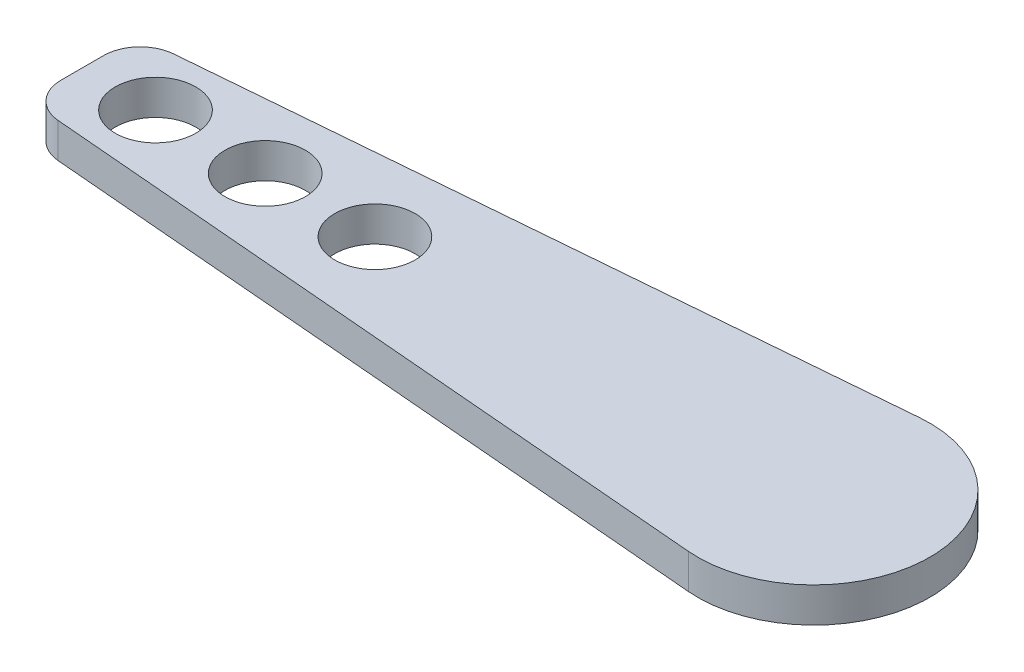
ISO-10303-21;
HEADER;
FILE_DESCRIPTION(('STEP AP214'),'2;1');
FILE_NAME('part.step','',(''),(''),'','','');
FILE_SCHEMA(('AUTOMOTIVE_DESIGN { 1 0 10303 214 1 1 1 1 }'));
ENDSEC;
DATA;
#1=APPLICATION_CONTEXT('core data for automotive mechanical design processes');
#2=APPLICATION_PROTOCOL_DEFINITION('international standard','automotive_design',2000,#1);
#3=PRODUCT_CONTEXT('',#1,'mechanical');
#4=PRODUCT('Part','Part','',(#3));
#5=PRODUCT_RELATED_PRODUCT_CATEGORY('part','',(#4));
#6=PRODUCT_DEFINITION_FORMATION('','',#4);
#7=PRODUCT_DEFINITION_CONTEXT('part definition',#1,'design');
#8=PRODUCT_DEFINITION('design','',#6,#7);
#9=PRODUCT_DEFINITION_SHAPE('','',#8);
#10=(LENGTH_UNIT() NAMED_UNIT(*) SI_UNIT(.MILLI.,.METRE.));
#11=(NAMED_UNIT(*) PLANE_ANGLE_UNIT() SI_UNIT($,.RADIAN.));
#12=(NAMED_UNIT(*) SI_UNIT($,.STERADIAN.) SOLID_ANGLE_UNIT());
#13=UNCERTAINTY_MEASURE_WITH_UNIT(LENGTH_MEASURE(1.E-05),#10,'distance_accuracy_value','');
#14=(GEOMETRIC_REPRESENTATION_CONTEXT(3) GLOBAL_UNCERTAINTY_ASSIGNED_CONTEXT((#13)) GLOBAL_UNIT_ASSIGNED_CONTEXT((#10,
#11,#12)) REPRESENTATION_CONTEXT('',''));
#15=CARTESIAN_POINT('',(0.,0.,0.));
#16=DIRECTION('',(0.,0.,1.));
#17=DIRECTION('',(1.,0.,0.));
#18=AXIS2_PLACEMENT_3D('',#15,#16,#17);
#19=CARTESIAN_POINT('',(-1.3337407331196,4.7625,15.8188735584054));
#20=DIRECTION('',(0.0840151642909981,0.,-0.996464476120025));
#21=DIRECTION('',(-0.996464476120025,0.,-0.0840151642909981));
#22=AXIS2_PLACEMENT_3D('',#19,#20,#21);
#23=PLANE('',#22);
#24=DIRECTION('',(0.996464476120026,0.,0.0840151642909981));
#25=VECTOR('',#24,1.);
#26=CARTESIAN_POINT('',(-1.3337407331196,4.7625,15.8188735584054));
#27=LINE('',#26,#25);
#28=CARTESIAN_POINT('',(-95.420075821455,4.7625,7.88614831890346));
#29=VERTEX_POINT('',#28);
#30=CARTESIAN_POINT('',(-1.3337407331196,4.7625,15.8188735584054));
#31=VERTEX_POINT('',#30);
#32=EDGE_CURVE('E92',#29,#31,#27,.T.);
#33=ORIENTED_EDGE('',*,*,#32,.F.);
#34=DIRECTION('',(0.,-1.,0.));
#35=VECTOR('',#34,1.);
#36=CARTESIAN_POINT('',(-95.420075821455,0.,7.88614831890347));
#37=LINE('',#36,#35);
#38=CARTESIAN_POINT('',(-95.420075821455,0.,7.88614831890346));
#39=VERTEX_POINT('',#38);
#40=EDGE_CURVE('E11',#29,#39,#37,.T.);
#41=ORIENTED_EDGE('',*,*,#40,.T.);
#42=DIRECTION('',(0.996464476120026,0.,0.0840151642909981));
#43=VECTOR('',#42,1.);
#44=CARTESIAN_POINT('',(-1.3337407331196,0.,15.8188735584054));
#45=LINE('',#44,#43);
#46=CARTESIAN_POINT('',(-1.3337407331196,0.,15.8188735584054));
#47=VERTEX_POINT('',#46);
#48=EDGE_CURVE('E111',#39,#47,#45,.T.);
#49=ORIENTED_EDGE('',*,*,#48,.T.);
#50=DIRECTION('',(0.,-1.,0.));
#51=VECTOR('',#50,1.);
#52=CARTESIAN_POINT('',(-1.3337407331196,4.7625,15.8188735584054));
#53=LINE('',#52,#51);
#54=EDGE_CURVE('E105',#31,#47,#53,.T.);
#55=ORIENTED_EDGE('',*,*,#54,.F.);
#56=EDGE_LOOP('',(#33,#41,#49,#55));
#57=FACE_BOUND('',#56,.T.);
#58=ADVANCED_FACE('F39',(#57),#23,.F.);
#59=CARTESIAN_POINT('',(0.,4.7625,0.));
#60=DIRECTION('',(0.,-1.,0.));
#61=DIRECTION('',(0.,0.,-1.));
#62=AXIS2_PLACEMENT_3D('',#59,#60,#61);
#63=CYLINDRICAL_SURFACE('',#62,15.875);
#64=CARTESIAN_POINT('',(0.,0.,0.));
#65=DIRECTION('',(0.,1.,0.));
#66=DIRECTION('',(0.,0.,1.));
#67=AXIS2_PLACEMENT_3D('',#64,#65,#66);
#68=CIRCLE('',#67,15.875);
#69=CARTESIAN_POINT('',(-1.3337407331196,0.,-15.8188735584054));
#70=VERTEX_POINT('',#69);
#71=EDGE_CURVE('E145',#47,#70,#68,.T.);
#72=ORIENTED_EDGE('',*,*,#71,.T.);
#73=DIRECTION('',(0.,-1.,0.));
#74=VECTOR('',#73,1.);
#75=CARTESIAN_POINT('',(-1.3337407331196,4.7625,-15.8188735584054));
#76=LINE('',#75,#74);
#77=CARTESIAN_POINT('',(-1.3337407331196,4.7625,-15.8188735584054));
#78=VERTEX_POINT('',#77);
#79=EDGE_CURVE('E107',#78,#70,#76,.T.);
#80=ORIENTED_EDGE('',*,*,#79,.F.);
#81=CARTESIAN_POINT('',(0.,4.7625,0.));
#82=DIRECTION('',(0.,1.,0.));
#83=DIRECTION('',(0.,0.,1.));
#84=AXIS2_PLACEMENT_3D('',#81,#82,#83);
#85=CIRCLE('',#84,15.875);
#86=EDGE_CURVE('E95',#31,#78,#85,.T.);
#87=ORIENTED_EDGE('',*,*,#86,.F.);
#88=ORIENTED_EDGE('',*,*,#54,.T.);
#89=EDGE_LOOP('',(#72,#80,#87,#88));
#90=FACE_BOUND('',#89,.T.);
#91=ADVANCED_FACE('F104',(#90),#63,.T.);
#92=CARTESIAN_POINT('',(-1.3337407331196,4.7625,-15.8188735584054));
#93=DIRECTION('',(0.0840151642909981,0.,0.996464476120025));
#94=DIRECTION('',(0.996464476120025,0.,-0.0840151642909981));
#95=AXIS2_PLACEMENT_3D('',#92,#93,#94);
#96=PLANE('',#95);
#97=DIRECTION('',(-0.996464476120026,0.,0.0840151642909981));
#98=VECTOR('',#97,1.);
#99=CARTESIAN_POINT('',(-1.3337407331196,0.,-15.8188735584054));
#100=LINE('',#99,#98);
#101=CARTESIAN_POINT('',(-95.420075821455,0.,-7.88614831890346));
#102=VERTEX_POINT('',#101);
#103=EDGE_CURVE('E142',#70,#102,#100,.T.);
#104=ORIENTED_EDGE('',*,*,#103,.T.);
#105=DIRECTION('',(0.,-1.,0.));
#106=VECTOR('',#105,1.);
#107=CARTESIAN_POINT('',(-95.420075821455,4.7625,-7.88614831890346));
#108=LINE('',#107,#106);
#109=CARTESIAN_POINT('',(-95.420075821455,4.7625,-7.88614831890346));
#110=VERTEX_POINT('',#109);
#111=EDGE_CURVE('E62',#102,#110,#108,.F.);
#112=ORIENTED_EDGE('',*,*,#111,.T.);
#113=DIRECTION('',(-0.996464476120026,0.,0.0840151642909981));
#114=VECTOR('',#113,1.);
#115=CARTESIAN_POINT('',(-1.3337407331196,4.7625,-15.8188735584054));
#116=LINE('',#115,#114);
#117=EDGE_CURVE('E108',#78,#110,#116,.T.);
#118=ORIENTED_EDGE('',*,*,#117,.F.);
#119=ORIENTED_EDGE('',*,*,#79,.T.);
#120=EDGE_LOOP('',(#104,#112,#118,#119));
#121=FACE_BOUND('',#120,.T.);
#122=ADVANCED_FACE('F144',(#121),#96,.F.);
#123=CARTESIAN_POINT('',(-90.,4.7625,0.));
#124=DIRECTION('',(0.,-1.,0.));
#125=DIRECTION('',(0.,0.,-1.));
#126=AXIS2_PLACEMENT_3D('',#123,#124,#125);
#127=CYLINDRICAL_SURFACE('',#126,5.5);
#128=CARTESIAN_POINT('',(-90.,4.7625,0.));
#129=DIRECTION('',(0.,1.,0.));
#130=DIRECTION('',(0.,0.,1.));
#131=AXIS2_PLACEMENT_3D('',#128,#129,#130);
#132=CIRCLE('',#131,5.5);
#133=CARTESIAN_POINT('',(-90.,4.7625,-5.5));
#134=VERTEX_POINT('',#133);
#135=EDGE_CURVE('E100',#134,#134,#132,.T.);
#136=CARTESIAN_POINT('',(-90.,0.,0.));
#137=DIRECTION('',(0.,1.,0.));
#138=DIRECTION('',(0.,0.,1.));
#139=AXIS2_PLACEMENT_3D('',#136,#137,#138);
#140=CIRCLE('',#139,5.5);
#141=CARTESIAN_POINT('',(-90.,0.,-5.5));
#142=VERTEX_POINT('',#141);
#143=EDGE_CURVE('E151',#142,#142,#140,.T.);
#144=CARTESIAN_POINT('',(-90.,4.7625,-5.5));
#145=CARTESIAN_POINT('',(-90.,4.712890625,-5.5));
#146=CARTESIAN_POINT('',(-90.,4.66328125,-5.5));
#147=CARTESIAN_POINT('',(-90.,4.5640625,-5.5));
#148=CARTESIAN_POINT('',(-90.,4.514453125,-5.5));
#149=CARTESIAN_POINT('',(-90.,4.415234375,-5.5));
#150=CARTESIAN_POINT('',(-90.,4.365625,-5.5));
#151=CARTESIAN_POINT('',(-90.,4.26640625,-5.5));
#152=CARTESIAN_POINT('',(-90.,4.216796875,-5.5));
#153=CARTESIAN_POINT('',(-90.,4.117578125,-5.5));
#154=CARTESIAN_POINT('',(-90.,4.06796875,-5.5));
#155=CARTESIAN_POINT('',(-90.,3.96875,-5.5));
#156=CARTESIAN_POINT('',(-90.,3.919140625,-5.5));
#157=CARTESIAN_POINT('',(-90.,3.819921875,-5.5));
#158=CARTESIAN_POINT('',(-90.,3.7703125,-5.5));
#159=CARTESIAN_POINT('',(-90.,3.67109375,-5.5));
#160=CARTESIAN_POINT('',(-90.,3.621484375,-5.5));
#161=CARTESIAN_POINT('',(-90.,3.522265625,-5.5));
#162=CARTESIAN_POINT('',(-90.,3.47265625,-5.5));
#163=CARTESIAN_POINT('',(-90.,3.3734375,-5.5));
#164=CARTESIAN_POINT('',(-90.,3.323828125,-5.5));
#165=CARTESIAN_POINT('',(-90.,3.224609375,-5.5));
#166=CARTESIAN_POINT('',(-90.,3.175,-5.5));
#167=CARTESIAN_POINT('',(-90.,3.07578125,-5.5));
#168=CARTESIAN_POINT('',(-90.,3.026171875,-5.5));
#169=CARTESIAN_POINT('',(-90.,2.926953125,-5.5));
#170=CARTESIAN_POINT('',(-90.,2.87734375,-5.5));
#171=CARTESIAN_POINT('',(-90.,2.778125,-5.5));
#172=CARTESIAN_POINT('',(-90.,2.728515625,-5.5));
#173=CARTESIAN_POINT('',(-90.,2.629296875,-5.5));
#174=CARTESIAN_POINT('',(-90.,2.5796875,-5.5));
#175=CARTESIAN_POINT('',(-90.,2.48046875,-5.5));
#176=CARTESIAN_POINT('',(-90.,2.430859375,-5.5));
#177=CARTESIAN_POINT('',(-90.,2.331640625,-5.5));
#178=CARTESIAN_POINT('',(-90.,2.28203125,-5.5));
#179=CARTESIAN_POINT('',(-90.,2.1828125,-5.5));
#180=CARTESIAN_POINT('',(-90.,2.133203125,-5.5));
#181=CARTESIAN_POINT('',(-90.,2.033984375,-5.5));
#182=CARTESIAN_POINT('',(-90.,1.984375,-5.5));
#183=CARTESIAN_POINT('',(-90.,1.88515625,-5.5));
#184=CARTESIAN_POINT('',(-90.,1.835546875,-5.5));
#185=CARTESIAN_POINT('',(-90.,1.736328125,-5.5));
#186=CARTESIAN_POINT('',(-90.,1.68671875,-5.5));
#187=CARTESIAN_POINT('',(-90.,1.5875,-5.5));
#188=CARTESIAN_POINT('',(-90.,1.537890625,-5.5));
#189=CARTESIAN_POINT('',(-90.,1.438671875,-5.5));
#190=CARTESIAN_POINT('',(-90.,1.3890625,-5.5));
#191=CARTESIAN_POINT('',(-90.,1.28984375,-5.5));
#192=CARTESIAN_POINT('',(-90.,1.240234375,-5.5));
#193=CARTESIAN_POINT('',(-90.,1.141015625,-5.5));
#194=CARTESIAN_POINT('',(-90.,1.09140625,-5.5));
#195=CARTESIAN_POINT('',(-90.,0.9921875,-5.5));
#196=CARTESIAN_POINT('',(-90.,0.942578125,-5.5));
#197=CARTESIAN_POINT('',(-90.,0.843359375,-5.5));
#198=CARTESIAN_POINT('',(-90.,0.79375,-5.5));
#199=CARTESIAN_POINT('',(-90.,0.69453125,-5.5));
#200=CARTESIAN_POINT('',(-90.,0.644921875,-5.5));
#201=CARTESIAN_POINT('',(-90.,0.545703125,-5.5));
#202=CARTESIAN_POINT('',(-90.,0.49609375,-5.5));
#203=CARTESIAN_POINT('',(-90.,0.396875,-5.5));
#204=CARTESIAN_POINT('',(-90.,0.347265625,-5.5));
#205=CARTESIAN_POINT('',(-90.,0.248046875,-5.5));
#206=CARTESIAN_POINT('',(-90.,0.1984375,-5.5));
#207=CARTESIAN_POINT('',(-90.,0.09921875,-5.5));
#208=CARTESIAN_POINT('',(-90.,0.049609375,-5.5));
#209=CARTESIAN_POINT('',(-90.,0.,-5.5));
#210=B_SPLINE_CURVE_WITH_KNOTS('',3,(#144,#145,#146,#147,#148,#149,#150,#151,#152,#153,#154,
#155,#156,#157,#158,#159,#160,#161,#162,#163,#164,#165,#166,#167,#168,#169,#170,#171,#172,#173,
#174,#175,#176,#177,#178,#179,#180,#181,#182,#183,#184,#185,#186,#187,#188,#189,#190,#191,#192,
#193,#194,#195,#196,#197,#198,#199,#200,#201,#202,#203,#204,#205,#206,#207,#208,#209),
.UNSPECIFIED.,.F.,.F.,(4,2,2,2,2,2,2,2,2,2,2,2,2,2,2,2,2,2,2,2,2,2,2,2,2,2,2,2,2,2,2,2,4),(0.,
0.148828124999999,0.297656249999999,0.446484374999999,0.595312499999999,0.744140625,0.89296875,
1.041796875,1.190625,1.339453125,1.48828125,1.637109375,1.7859375,1.934765625,2.08359375,
2.232421875,2.38125,2.530078125,2.67890625,2.827734375,2.9765625,3.125390625,3.27421875,
3.423046875,3.571875,3.720703125,3.86953125,4.018359375,4.1671875,4.316015625,4.46484375,
4.613671875,4.7625),.UNSPECIFIED.);
#211=EDGE_CURVE('BSEAM179',#134,#142,#210,.T.);
#212=ORIENTED_EDGE('',*,*,#135,.T.);
#213=ORIENTED_EDGE('',*,*,#143,.F.);
#214=ORIENTED_EDGE('',*,*,#211,.T.);
#215=ORIENTED_EDGE('',*,*,#211,.F.);
#216=EDGE_LOOP('',(#212,#214,#213,#215));
#217=FACE_BOUND('',#216,.T.);
#218=ADVANCED_FACE('F179',(#217),#127,.F.);
#219=CARTESIAN_POINT('',(-75.,4.7625,0.));
#220=DIRECTION('',(0.,-1.,0.));
#221=DIRECTION('',(0.,0.,-1.));
#222=AXIS2_PLACEMENT_3D('',#219,#220,#221);
#223=CYLINDRICAL_SURFACE('',#222,5.5);
#224=CARTESIAN_POINT('',(-75.,4.7625,0.));
#225=DIRECTION('',(0.,1.,0.));
#226=DIRECTION('',(0.,0.,1.));
#227=AXIS2_PLACEMENT_3D('',#224,#225,#226);
#228=CIRCLE('',#227,5.5);
#229=CARTESIAN_POINT('',(-75.,4.7625,-5.5));
#230=VERTEX_POINT('',#229);
#231=EDGE_CURVE('E163',#230,#230,#228,.T.);
#232=CARTESIAN_POINT('',(-75.,0.,0.));
#233=DIRECTION('',(0.,1.,0.));
#234=DIRECTION('',(0.,0.,1.));
#235=AXIS2_PLACEMENT_3D('',#232,#233,#234);
#236=CIRCLE('',#235,5.5);
#237=CARTESIAN_POINT('',(-75.,0.,-5.5));
#238=VERTEX_POINT('',#237);
#239=EDGE_CURVE('E154',#238,#238,#236,.T.);
#240=CARTESIAN_POINT('',(-75.,4.7625,-5.5));
#241=CARTESIAN_POINT('',(-75.,4.712890625,-5.5));
#242=CARTESIAN_POINT('',(-75.,4.66328125,-5.5));
#243=CARTESIAN_POINT('',(-75.,4.5640625,-5.5));
#244=CARTESIAN_POINT('',(-75.,4.514453125,-5.5));
#245=CARTESIAN_POINT('',(-75.,4.415234375,-5.5));
#246=CARTESIAN_POINT('',(-75.,4.365625,-5.5));
#247=CARTESIAN_POINT('',(-75.,4.26640625,-5.5));
#248=CARTESIAN_POINT('',(-75.,4.216796875,-5.5));
#249=CARTESIAN_POINT('',(-75.,4.117578125,-5.5));
#250=CARTESIAN_POINT('',(-75.,4.06796875,-5.5));
#251=CARTESIAN_POINT('',(-75.,3.96875,-5.5));
#252=CARTESIAN_POINT('',(-75.,3.919140625,-5.5));
#253=CARTESIAN_POINT('',(-75.,3.819921875,-5.5));
#254=CARTESIAN_POINT('',(-75.,3.7703125,-5.5));
#255=CARTESIAN_POINT('',(-75.,3.67109375,-5.5));
#256=CARTESIAN_POINT('',(-75.,3.621484375,-5.5));
#257=CARTESIAN_POINT('',(-75.,3.522265625,-5.5));
#258=CARTESIAN_POINT('',(-75.,3.47265625,-5.5));
#259=CARTESIAN_POINT('',(-75.,3.3734375,-5.5));
#260=CARTESIAN_POINT('',(-75.,3.323828125,-5.5));
#261=CARTESIAN_POINT('',(-75.,3.224609375,-5.5));
#262=CARTESIAN_POINT('',(-75.,3.175,-5.5));
#263=CARTESIAN_POINT('',(-75.,3.07578125,-5.5));
#264=CARTESIAN_POINT('',(-75.,3.026171875,-5.5));
#265=CARTESIAN_POINT('',(-75.,2.926953125,-5.5));
#266=CARTESIAN_POINT('',(-75.,2.87734375,-5.5));
#267=CARTESIAN_POINT('',(-75.,2.778125,-5.5));
#268=CARTESIAN_POINT('',(-75.,2.728515625,-5.5));
#269=CARTESIAN_POINT('',(-75.,2.629296875,-5.5));
#270=CARTESIAN_POINT('',(-75.,2.5796875,-5.5));
#271=CARTESIAN_POINT('',(-75.,2.48046875,-5.5));
#272=CARTESIAN_POINT('',(-75.,2.430859375,-5.5));
#273=CARTESIAN_POINT('',(-75.,2.331640625,-5.5));
#274=CARTESIAN_POINT('',(-75.,2.28203125,-5.5));
#275=CARTESIAN_POINT('',(-75.,2.1828125,-5.5));
#276=CARTESIAN_POINT('',(-75.,2.133203125,-5.5));
#277=CARTESIAN_POINT('',(-75.,2.033984375,-5.5));
#278=CARTESIAN_POINT('',(-75.,1.984375,-5.5));
#279=CARTESIAN_POINT('',(-75.,1.88515625,-5.5));
#280=CARTESIAN_POINT('',(-75.,1.835546875,-5.5));
#281=CARTESIAN_POINT('',(-75.,1.736328125,-5.5));
#282=CARTESIAN_POINT('',(-75.,1.68671875,-5.5));
#283=CARTESIAN_POINT('',(-75.,1.5875,-5.5));
#284=CARTESIAN_POINT('',(-75.,1.537890625,-5.5));
#285=CARTESIAN_POINT('',(-75.,1.438671875,-5.5));
#286=CARTESIAN_POINT('',(-75.,1.3890625,-5.5));
#287=CARTESIAN_POINT('',(-75.,1.28984375,-5.5));
#288=CARTESIAN_POINT('',(-75.,1.240234375,-5.5));
#289=CARTESIAN_POINT('',(-75.,1.141015625,-5.5));
#290=CARTESIAN_POINT('',(-75.,1.09140625,-5.5));
#291=CARTESIAN_POINT('',(-75.,0.9921875,-5.5));
#292=CARTESIAN_POINT('',(-75.,0.942578125,-5.5));
#293=CARTESIAN_POINT('',(-75.,0.843359375,-5.5));
#294=CARTESIAN_POINT('',(-75.,0.79375,-5.5));
#295=CARTESIAN_POINT('',(-75.,0.69453125,-5.5));
#296=CARTESIAN_POINT('',(-75.,0.644921875,-5.5));
#297=CARTESIAN_POINT('',(-75.,0.545703125,-5.5));
#298=CARTESIAN_POINT('',(-75.,0.49609375,-5.5));
#299=CARTESIAN_POINT('',(-75.,0.396875,-5.5));
#300=CARTESIAN_POINT('',(-75.,0.347265625,-5.5));
#301=CARTESIAN_POINT('',(-75.,0.248046875,-5.5));
#302=CARTESIAN_POINT('',(-75.,0.1984375,-5.5));
#303=CARTESIAN_POINT('',(-75.,0.09921875,-5.5));
#304=CARTESIAN_POINT('',(-75.,0.049609375,-5.5));
#305=CARTESIAN_POINT('',(-75.,0.,-5.5));
#306=B_SPLINE_CURVE_WITH_KNOTS('',3,(#240,#241,#242,#243,#244,#245,#246,#247,#248,#249,#250,
#251,#252,#253,#254,#255,#256,#257,#258,#259,#260,#261,#262,#263,#264,#265,#266,#267,#268,#269,
#270,#271,#272,#273,#274,#275,#276,#277,#278,#279,#280,#281,#282,#283,#284,#285,#286,#287,#288,
#289,#290,#291,#292,#293,#294,#295,#296,#297,#298,#299,#300,#301,#302,#303,#304,#305),
.UNSPECIFIED.,.F.,.F.,(4,2,2,2,2,2,2,2,2,2,2,2,2,2,2,2,2,2,2,2,2,2,2,2,2,2,2,2,2,2,2,2,4),(0.,
0.148828124999999,0.297656249999999,0.446484374999999,0.595312499999999,0.744140625,0.89296875,
1.041796875,1.190625,1.339453125,1.48828125,1.637109375,1.7859375,1.934765625,2.08359375,
2.232421875,2.38125,2.530078125,2.67890625,2.827734375,2.9765625,3.125390625,3.27421875,
3.423046875,3.571875,3.720703125,3.86953125,4.018359375,4.1671875,4.316015625,4.46484375,
4.613671875,4.7625),.UNSPECIFIED.);
#307=EDGE_CURVE('BSEAM182',#230,#238,#306,.T.);
#308=ORIENTED_EDGE('',*,*,#231,.T.);
#309=ORIENTED_EDGE('',*,*,#239,.F.);
#310=ORIENTED_EDGE('',*,*,#307,.T.);
#311=ORIENTED_EDGE('',*,*,#307,.F.);
#312=EDGE_LOOP('',(#308,#310,#309,#311));
#313=FACE_BOUND('',#312,.T.);
#314=ADVANCED_FACE('F182',(#313),#223,.F.);
#315=CARTESIAN_POINT('',(-60.,4.7625,0.));
#316=DIRECTION('',(0.,-1.,0.));
#317=DIRECTION('',(0.,0.,-1.));
#318=AXIS2_PLACEMENT_3D('',#315,#316,#317);
#319=CYLINDRICAL_SURFACE('',#318,5.5);
#320=CARTESIAN_POINT('',(-60.,4.7625,0.));
#321=DIRECTION('',(0.,1.,0.));
#322=DIRECTION('',(0.,0.,1.));
#323=AXIS2_PLACEMENT_3D('',#320,#321,#322);
#324=CIRCLE('',#323,5.5);
#325=CARTESIAN_POINT('',(-60.,4.7625,-5.5));
#326=VERTEX_POINT('',#325);
#327=EDGE_CURVE('E147',#326,#326,#324,.T.);
#328=CARTESIAN_POINT('',(-60.,0.,0.));
#329=DIRECTION('',(0.,1.,0.));
#330=DIRECTION('',(0.,0.,1.));
#331=AXIS2_PLACEMENT_3D('',#328,#329,#330);
#332=CIRCLE('',#331,5.5);
#333=CARTESIAN_POINT('',(-60.,0.,-5.5));
#334=VERTEX_POINT('',#333);
#335=EDGE_CURVE('E157',#334,#334,#332,.T.);
#336=CARTESIAN_POINT('',(-60.,4.7625,-5.5));
#337=CARTESIAN_POINT('',(-60.,4.712890625,-5.5));
#338=CARTESIAN_POINT('',(-60.,4.66328125,-5.5));
#339=CARTESIAN_POINT('',(-60.,4.5640625,-5.5));
#340=CARTESIAN_POINT('',(-60.,4.514453125,-5.5));
#341=CARTESIAN_POINT('',(-60.,4.415234375,-5.5));
#342=CARTESIAN_POINT('',(-60.,4.365625,-5.5));
#343=CARTESIAN_POINT('',(-60.,4.26640625,-5.5));
#344=CARTESIAN_POINT('',(-60.,4.216796875,-5.5));
#345=CARTESIAN_POINT('',(-60.,4.117578125,-5.5));
#346=CARTESIAN_POINT('',(-60.,4.06796875,-5.5));
#347=CARTESIAN_POINT('',(-60.,3.96875,-5.5));
#348=CARTESIAN_POINT('',(-60.,3.919140625,-5.5));
#349=CARTESIAN_POINT('',(-60.,3.819921875,-5.5));
#350=CARTESIAN_POINT('',(-60.,3.7703125,-5.5));
#351=CARTESIAN_POINT('',(-60.,3.67109375,-5.5));
#352=CARTESIAN_POINT('',(-60.,3.621484375,-5.5));
#353=CARTESIAN_POINT('',(-60.,3.522265625,-5.5));
#354=CARTESIAN_POINT('',(-60.,3.47265625,-5.5));
#355=CARTESIAN_POINT('',(-60.,3.3734375,-5.5));
#356=CARTESIAN_POINT('',(-60.,3.323828125,-5.5));
#357=CARTESIAN_POINT('',(-60.,3.224609375,-5.5));
#358=CARTESIAN_POINT('',(-60.,3.175,-5.5));
#359=CARTESIAN_POINT('',(-60.,3.07578125,-5.5));
#360=CARTESIAN_POINT('',(-60.,3.026171875,-5.5));
#361=CARTESIAN_POINT('',(-60.,2.926953125,-5.5));
#362=CARTESIAN_POINT('',(-60.,2.87734375,-5.5));
#363=CARTESIAN_POINT('',(-60.,2.778125,-5.5));
#364=CARTESIAN_POINT('',(-60.,2.728515625,-5.5));
#365=CARTESIAN_POINT('',(-60.,2.629296875,-5.5));
#366=CARTESIAN_POINT('',(-60.,2.5796875,-5.5));
#367=CARTESIAN_POINT('',(-60.,2.48046875,-5.5));
#368=CARTESIAN_POINT('',(-60.,2.430859375,-5.5));
#369=CARTESIAN_POINT('',(-60.,2.331640625,-5.5));
#370=CARTESIAN_POINT('',(-60.,2.28203125,-5.5));
#371=CARTESIAN_POINT('',(-60.,2.1828125,-5.5));
#372=CARTESIAN_POINT('',(-60.,2.133203125,-5.5));
#373=CARTESIAN_POINT('',(-60.,2.033984375,-5.5));
#374=CARTESIAN_POINT('',(-60.,1.984375,-5.5));
#375=CARTESIAN_POINT('',(-60.,1.88515625,-5.5));
#376=CARTESIAN_POINT('',(-60.,1.835546875,-5.5));
#377=CARTESIAN_POINT('',(-60.,1.736328125,-5.5));
#378=CARTESIAN_POINT('',(-60.,1.68671875,-5.5));
#379=CARTESIAN_POINT('',(-60.,1.5875,-5.5));
#380=CARTESIAN_POINT('',(-60.,1.537890625,-5.5));
#381=CARTESIAN_POINT('',(-60.,1.438671875,-5.5));
#382=CARTESIAN_POINT('',(-60.,1.3890625,-5.5));
#383=CARTESIAN_POINT('',(-60.,1.28984375,-5.5));
#384=CARTESIAN_POINT('',(-60.,1.240234375,-5.5));
#385=CARTESIAN_POINT('',(-60.,1.141015625,-5.5));
#386=CARTESIAN_POINT('',(-60.,1.09140625,-5.5));
#387=CARTESIAN_POINT('',(-60.,0.9921875,-5.5));
#388=CARTESIAN_POINT('',(-60.,0.942578125,-5.5));
#389=CARTESIAN_POINT('',(-60.,0.843359375,-5.5));
#390=CARTESIAN_POINT('',(-60.,0.79375,-5.5));
#391=CARTESIAN_POINT('',(-60.,0.69453125,-5.5));
#392=CARTESIAN_POINT('',(-60.,0.644921875,-5.5));
#393=CARTESIAN_POINT('',(-60.,0.545703125,-5.5));
#394=CARTESIAN_POINT('',(-60.,0.49609375,-5.5));
#395=CARTESIAN_POINT('',(-60.,0.396875,-5.5));
#396=CARTESIAN_POINT('',(-60.,0.347265625,-5.5));
#397=CARTESIAN_POINT('',(-60.,0.248046875,-5.5));
#398=CARTESIAN_POINT('',(-60.,0.1984375,-5.5));
#399=CARTESIAN_POINT('',(-60.,0.09921875,-5.5));
#400=CARTESIAN_POINT('',(-60.,0.049609375,-5.5));
#401=CARTESIAN_POINT('',(-60.,0.,-5.5));
#402=B_SPLINE_CURVE_WITH_KNOTS('',3,(#336,#337,#338,#339,#340,#341,#342,#343,#344,#345,#346,
#347,#348,#349,#350,#351,#352,#353,#354,#355,#356,#357,#358,#359,#360,#361,#362,#363,#364,#365,
#366,#367,#368,#369,#370,#371,#372,#373,#374,#375,#376,#377,#378,#379,#380,#381,#382,#383,#384,
#385,#386,#387,#388,#389,#390,#391,#392,#393,#394,#395,#396,#397,#398,#399,#400,#401),
.UNSPECIFIED.,.F.,.F.,(4,2,2,2,2,2,2,2,2,2,2,2,2,2,2,2,2,2,2,2,2,2,2,2,2,2,2,2,2,2,2,2,4),(0.,
0.148828124999999,0.297656249999999,0.446484374999999,0.595312499999999,0.744140625,0.89296875,
1.041796875,1.190625,1.339453125,1.48828125,1.637109375,1.7859375,1.934765625,2.08359375,
2.232421875,2.38125,2.530078125,2.67890625,2.827734375,2.9765625,3.125390625,3.27421875,
3.423046875,3.571875,3.720703125,3.86953125,4.018359375,4.1671875,4.316015625,4.46484375,
4.613671875,4.7625),.UNSPECIFIED.);
#403=EDGE_CURVE('BSEAM169',#326,#334,#402,.T.);
#404=ORIENTED_EDGE('',*,*,#327,.T.);
#405=ORIENTED_EDGE('',*,*,#335,.F.);
#406=ORIENTED_EDGE('',*,*,#403,.T.);
#407=ORIENTED_EDGE('',*,*,#403,.F.);
#408=EDGE_LOOP('',(#404,#406,#405,#407));
#409=FACE_BOUND('',#408,.T.);
#410=ADVANCED_FACE('F169',(#409),#319,.F.);
#411=CARTESIAN_POINT('',(-100.,4.7625,0.));
#412=DIRECTION('',(-1.,0.,0.));
#413=DIRECTION('',(0.,0.,1.));
#414=AXIS2_PLACEMENT_3D('',#411,#412,#413);
#415=PLANE('',#414);
#416=DIRECTION('',(0.,0.,-1.));
#417=VECTOR('',#416,1.);
#418=CARTESIAN_POINT('',(-100.,4.7625,0.));
#419=LINE('',#418,#417);
#420=CARTESIAN_POINT('',(-100.,4.7625,2.90382593830334));
#421=VERTEX_POINT('',#420);
#422=CARTESIAN_POINT('',(-100.,4.7625,-2.90382593830334));
#423=VERTEX_POINT('',#422);
#424=EDGE_CURVE('E117',#421,#423,#419,.T.);
#425=ORIENTED_EDGE('',*,*,#424,.T.);
#426=DIRECTION('',(0.,-1.,0.));
#427=VECTOR('',#426,1.);
#428=CARTESIAN_POINT('',(-100.,0.,-2.90382593830334));
#429=LINE('',#428,#427);
#430=CARTESIAN_POINT('',(-100.,0.,-2.90382593830334));
#431=VERTEX_POINT('',#430);
#432=EDGE_CURVE('E115',#423,#431,#429,.T.);
#433=ORIENTED_EDGE('',*,*,#432,.T.);
#434=DIRECTION('',(0.,0.,-1.));
#435=VECTOR('',#434,1.);
#436=CARTESIAN_POINT('',(-100.,0.,0.));
#437=LINE('',#436,#435);
#438=CARTESIAN_POINT('',(-100.,0.,2.90382593830334));
#439=VERTEX_POINT('',#438);
#440=EDGE_CURVE('E143',#439,#431,#437,.T.);
#441=ORIENTED_EDGE('',*,*,#440,.F.);
#442=DIRECTION('',(0.,-1.,0.));
#443=VECTOR('',#442,1.);
#444=CARTESIAN_POINT('',(-100.,4.7625,2.90382593830334));
#445=LINE('',#444,#443);
#446=EDGE_CURVE('E113',#439,#421,#445,.F.);
#447=ORIENTED_EDGE('',*,*,#446,.T.);
#448=EDGE_LOOP('',(#425,#433,#441,#447));
#449=FACE_BOUND('',#448,.T.);
#450=ADVANCED_FACE('F133',(#449),#415,.T.);
#451=CARTESIAN_POINT('',(0.,4.7625,0.));
#452=DIRECTION('',(0.,1.,0.));
#453=DIRECTION('',(0.,0.,1.));
#454=AXIS2_PLACEMENT_3D('',#451,#452,#453);
#455=PLANE('',#454);
#456=ORIENTED_EDGE('',*,*,#327,.F.);
#457=EDGE_LOOP('',(#456));
#458=FACE_BOUND('',#457,.T.);
#459=ORIENTED_EDGE('',*,*,#231,.F.);
#460=EDGE_LOOP('',(#459));
#461=FACE_BOUND('',#460,.T.);
#462=ORIENTED_EDGE('',*,*,#135,.F.);
#463=EDGE_LOOP('',(#462));
#464=FACE_BOUND('',#463,.T.);
#465=ORIENTED_EDGE('',*,*,#117,.T.);
#466=CARTESIAN_POINT('',(-95.,4.7625,-2.90382593830334));
#467=DIRECTION('',(0.,1.,0.));
#468=DIRECTION('',(0.,0.,1.));
#469=AXIS2_PLACEMENT_3D('',#466,#467,#468);
#470=CIRCLE('',#469,5.);
#471=EDGE_CURVE('E47',#110,#423,#470,.T.);
#472=ORIENTED_EDGE('',*,*,#471,.T.);
#473=ORIENTED_EDGE('',*,*,#424,.F.);
#474=CARTESIAN_POINT('',(-95.,4.7625,2.90382593830334));
#475=DIRECTION('',(0.,1.,0.));
#476=DIRECTION('',(0.,0.,1.));
#477=AXIS2_PLACEMENT_3D('',#474,#475,#476);
#478=CIRCLE('',#477,5.);
#479=EDGE_CURVE('E54',#421,#29,#478,.T.);
#480=ORIENTED_EDGE('',*,*,#479,.T.);
#481=ORIENTED_EDGE('',*,*,#32,.T.);
#482=ORIENTED_EDGE('',*,*,#86,.T.);
#483=EDGE_LOOP('',(#465,#472,#473,#480,#481,#482));
#484=FACE_BOUND('',#483,.T.);
#485=ADVANCED_FACE('F94',(#458,#461,#464,#484),#455,.T.);
#486=CARTESIAN_POINT('',(0.,0.,0.));
#487=DIRECTION('',(0.,1.,0.));
#488=DIRECTION('',(0.,0.,1.));
#489=AXIS2_PLACEMENT_3D('',#486,#487,#488);
#490=PLANE('',#489);
#491=ORIENTED_EDGE('',*,*,#335,.T.);
#492=EDGE_LOOP('',(#491));
#493=FACE_BOUND('',#492,.T.);
#494=ORIENTED_EDGE('',*,*,#239,.T.);
#495=EDGE_LOOP('',(#494));
#496=FACE_BOUND('',#495,.T.);
#497=ORIENTED_EDGE('',*,*,#143,.T.);
#498=EDGE_LOOP('',(#497));
#499=FACE_BOUND('',#498,.T.);
#500=ORIENTED_EDGE('',*,*,#440,.T.);
#501=CARTESIAN_POINT('',(-95.,0.,-2.90382593830334));
#502=DIRECTION('',(0.,1.,0.));
#503=DIRECTION('',(0.,0.,1.));
#504=AXIS2_PLACEMENT_3D('',#501,#502,#503);
#505=CIRCLE('',#504,5.);
#506=EDGE_CURVE('E125',#431,#102,#505,.F.);
#507=ORIENTED_EDGE('',*,*,#506,.T.);
#508=ORIENTED_EDGE('',*,*,#103,.F.);
#509=ORIENTED_EDGE('',*,*,#71,.F.);
#510=ORIENTED_EDGE('',*,*,#48,.F.);
#511=CARTESIAN_POINT('',(-95.,0.,2.90382593830334));
#512=DIRECTION('',(0.,1.,0.));
#513=DIRECTION('',(0.,0.,1.));
#514=AXIS2_PLACEMENT_3D('',#511,#512,#513);
#515=CIRCLE('',#514,5.);
#516=EDGE_CURVE('E123',#39,#439,#515,.F.);
#517=ORIENTED_EDGE('',*,*,#516,.T.);
#518=EDGE_LOOP('',(#500,#507,#508,#509,#510,#517));
#519=FACE_BOUND('',#518,.T.);
#520=ADVANCED_FACE('F141',(#493,#496,#499,#519),#490,.F.);
#521=CARTESIAN_POINT('',(-95.,4.7625,-2.90382593830334));
#522=DIRECTION('',(0.,1.,0.));
#523=DIRECTION('',(0.,0.,1.));
#524=AXIS2_PLACEMENT_3D('',#521,#522,#523);
#525=CYLINDRICAL_SURFACE('',#524,5.);
#526=ORIENTED_EDGE('',*,*,#471,.F.);
#527=ORIENTED_EDGE('',*,*,#111,.F.);
#528=ORIENTED_EDGE('',*,*,#506,.F.);
#529=ORIENTED_EDGE('',*,*,#432,.F.);
#530=EDGE_LOOP('',(#526,#527,#528,#529));
#531=FACE_BOUND('',#530,.T.);
#532=ADVANCED_FACE('F138',(#531),#525,.T.);
#533=CARTESIAN_POINT('',(-95.,4.7625,2.90382593830334));
#534=DIRECTION('',(0.,1.,0.));
#535=DIRECTION('',(0.,0.,1.));
#536=AXIS2_PLACEMENT_3D('',#533,#534,#535);
#537=CYLINDRICAL_SURFACE('',#536,5.);
#538=ORIENTED_EDGE('',*,*,#479,.F.);
#539=ORIENTED_EDGE('',*,*,#446,.F.);
#540=ORIENTED_EDGE('',*,*,#516,.F.);
#541=ORIENTED_EDGE('',*,*,#40,.F.);
#542=EDGE_LOOP('',(#538,#539,#540,#541));
#543=FACE_BOUND('',#542,.T.);
#544=ADVANCED_FACE('F41',(#543),#537,.T.);
#545=CLOSED_SHELL('',(#58,#91,#122,#218,#314,#410,#450,#485,#520,#532,#544));
#546=MANIFOLD_SOLID_BREP('B2',#545);
#547=ADVANCED_BREP_SHAPE_REPRESENTATION('',(#18,#546),#14);
#548=SHAPE_DEFINITION_REPRESENTATION(#9,#547);
ENDSEC;
END-ISO-10303-21;
